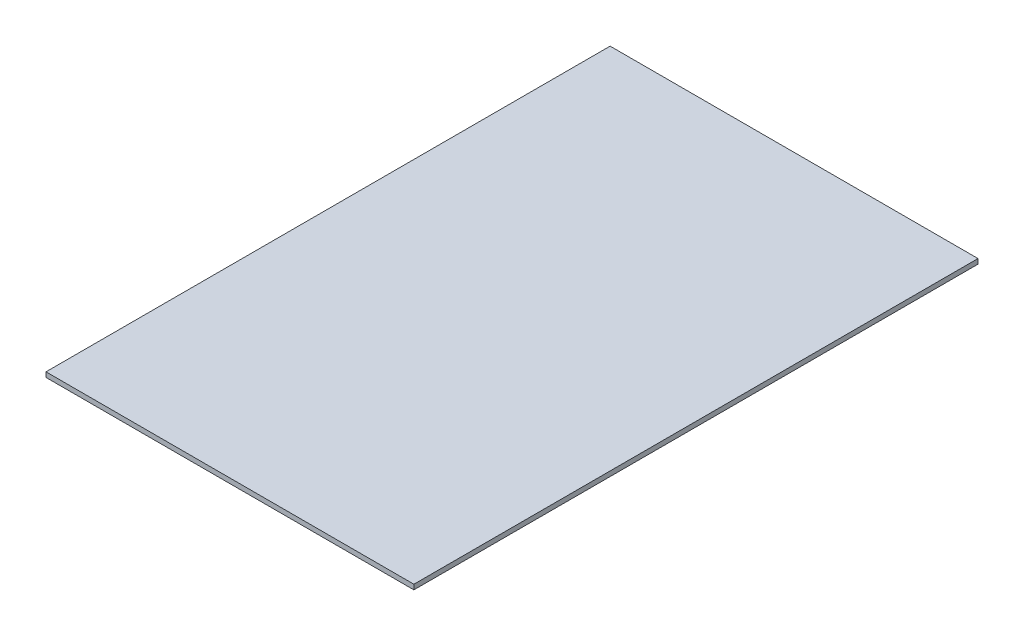
ISO-10303-21;
HEADER;
FILE_DESCRIPTION(('STEP AP214'),'2;1');
FILE_NAME('part.step','',(''),(''),'','','');
FILE_SCHEMA(('AUTOMOTIVE_DESIGN { 1 0 10303 214 1 1 1 1 }'));
ENDSEC;
DATA;
#1=APPLICATION_CONTEXT('core data for automotive mechanical design processes');
#2=APPLICATION_PROTOCOL_DEFINITION('international standard','automotive_design',2000,#1);
#3=PRODUCT_CONTEXT('',#1,'mechanical');
#4=PRODUCT('Part','Part','',(#3));
#5=PRODUCT_RELATED_PRODUCT_CATEGORY('part','',(#4));
#6=PRODUCT_DEFINITION_FORMATION('','',#4);
#7=PRODUCT_DEFINITION_CONTEXT('part definition',#1,'design');
#8=PRODUCT_DEFINITION('design','',#6,#7);
#9=PRODUCT_DEFINITION_SHAPE('','',#8);
#10=(LENGTH_UNIT() NAMED_UNIT(*) SI_UNIT(.MILLI.,.METRE.));
#11=(NAMED_UNIT(*) PLANE_ANGLE_UNIT() SI_UNIT($,.RADIAN.));
#12=(NAMED_UNIT(*) SI_UNIT($,.STERADIAN.) SOLID_ANGLE_UNIT());
#13=UNCERTAINTY_MEASURE_WITH_UNIT(LENGTH_MEASURE(1.E-05),#10,'distance_accuracy_value','');
#14=(GEOMETRIC_REPRESENTATION_CONTEXT(3) GLOBAL_UNCERTAINTY_ASSIGNED_CONTEXT((#13)) GLOBAL_UNIT_ASSIGNED_CONTEXT((#10,
#11,#12)) REPRESENTATION_CONTEXT('',''));
#15=CARTESIAN_POINT('',(0.,0.,0.));
#16=DIRECTION('',(0.,0.,1.));
#17=DIRECTION('',(1.,0.,0.));
#18=AXIS2_PLACEMENT_3D('',#15,#16,#17);
#19=CARTESIAN_POINT('',(-0.321302025404601,395.469835922906,-442.519627334862));
#20=DIRECTION('',(-1.,0.,0.));
#21=DIRECTION('',(0.,0.,1.));
#22=AXIS2_PLACEMENT_3D('',#19,#20,#21);
#23=PLANE('',#22);
#24=DIRECTION('',(0.,0.,1.));
#25=VECTOR('',#24,1.);
#26=CARTESIAN_POINT('',(-0.321302025404601,400.469835922906,-442.519627334862));
#27=LINE('',#26,#25);
#28=CARTESIAN_POINT('',(-0.321302025404618,400.469835922906,-430.019627334862));
#29=VERTEX_POINT('',#28);
#30=CARTESIAN_POINT('',(-0.321302025404643,400.469835922906,144.980372665138));
#31=VERTEX_POINT('',#30);
#32=EDGE_CURVE('E97',#29,#31,#27,.T.);
#33=ORIENTED_EDGE('',*,*,#32,.F.);
#34=DIRECTION('',(0.,1.,0.));
#35=VECTOR('',#34,1.);
#36=CARTESIAN_POINT('',(-0.321302025404618,395.469835922906,-430.019627334862));
#37=LINE('',#36,#35);
#38=CARTESIAN_POINT('',(-0.321302025404618,395.469835922906,-430.019627334862));
#39=VERTEX_POINT('',#38);
#40=EDGE_CURVE('E11',#39,#29,#37,.T.);
#41=ORIENTED_EDGE('',*,*,#40,.F.);
#42=DIRECTION('',(0.,0.,1.));
#43=VECTOR('',#42,1.);
#44=CARTESIAN_POINT('',(-0.321302025404601,395.469835922906,-442.519627334862));
#45=LINE('',#44,#43);
#46=CARTESIAN_POINT('',(-0.321302025404643,395.469835922906,144.980372665138));
#47=VERTEX_POINT('',#46);
#48=EDGE_CURVE('E91',#39,#47,#45,.T.);
#49=ORIENTED_EDGE('',*,*,#48,.T.);
#50=DIRECTION('',(0.,1.,0.));
#51=VECTOR('',#50,1.);
#52=CARTESIAN_POINT('',(-0.321302025404643,395.469835922906,144.980372665138));
#53=LINE('',#52,#51);
#54=EDGE_CURVE('E36',#47,#31,#53,.T.);
#55=ORIENTED_EDGE('',*,*,#54,.T.);
#56=EDGE_LOOP('',(#33,#41,#49,#55));
#57=FACE_BOUND('',#56,.T.);
#58=ADVANCED_FACE('F33',(#57),#23,.T.);
#59=CARTESIAN_POINT('',(-19.6213020254046,395.469835922906,-430.019627334862));
#60=DIRECTION('',(0.,0.,-1.));
#61=DIRECTION('',(-1.,0.,0.));
#62=AXIS2_PLACEMENT_3D('',#59,#60,#61);
#63=PLANE('',#62);
#64=DIRECTION('',(-1.,0.,0.));
#65=VECTOR('',#64,1.);
#66=CARTESIAN_POINT('',(-19.6213020254046,400.469835922906,-430.019627334862));
#67=LINE('',#66,#65);
#68=CARTESIAN_POINT('',(374.678697974595,400.469835922906,-430.019627334862));
#69=VERTEX_POINT('',#68);
#70=EDGE_CURVE('E93',#69,#29,#67,.T.);
#71=ORIENTED_EDGE('',*,*,#70,.F.);
#72=DIRECTION('',(0.,1.,0.));
#73=VECTOR('',#72,1.);
#74=CARTESIAN_POINT('',(374.678697974595,395.469835922906,-430.019627334862));
#75=LINE('',#74,#73);
#76=CARTESIAN_POINT('',(374.678697974595,395.469835922906,-430.019627334862));
#77=VERTEX_POINT('',#76);
#78=EDGE_CURVE('E42',#77,#69,#75,.T.);
#79=ORIENTED_EDGE('',*,*,#78,.F.);
#80=DIRECTION('',(-1.,0.,0.));
#81=VECTOR('',#80,1.);
#82=CARTESIAN_POINT('',(-19.6213020254046,395.469835922906,-430.019627334862));
#83=LINE('',#82,#81);
#84=EDGE_CURVE('E88',#77,#39,#83,.T.);
#85=ORIENTED_EDGE('',*,*,#84,.T.);
#86=ORIENTED_EDGE('',*,*,#40,.T.);
#87=EDGE_LOOP('',(#71,#79,#85,#86));
#88=FACE_BOUND('',#87,.T.);
#89=ADVANCED_FACE('F107',(#88),#63,.T.);
#90=CARTESIAN_POINT('',(374.678697974595,395.469835922906,-442.519627334862));
#91=DIRECTION('',(1.,0.,0.));
#92=DIRECTION('',(0.,0.,-1.));
#93=AXIS2_PLACEMENT_3D('',#90,#91,#92);
#94=PLANE('',#93);
#95=DIRECTION('',(0.,0.,-1.));
#96=VECTOR('',#95,1.);
#97=CARTESIAN_POINT('',(374.678697974595,400.469835922906,-442.519627334862));
#98=LINE('',#97,#96);
#99=CARTESIAN_POINT('',(374.678697974595,400.469835922906,144.980372665138));
#100=VERTEX_POINT('',#99);
#101=EDGE_CURVE('E83',#100,#69,#98,.T.);
#102=ORIENTED_EDGE('',*,*,#101,.F.);
#103=DIRECTION('',(0.,1.,0.));
#104=VECTOR('',#103,1.);
#105=CARTESIAN_POINT('',(374.678697974595,395.469835922906,144.980372665138));
#106=LINE('',#105,#104);
#107=CARTESIAN_POINT('',(374.678697974595,395.469835922906,144.980372665138));
#108=VERTEX_POINT('',#107);
#109=EDGE_CURVE('E78',#108,#100,#106,.T.);
#110=ORIENTED_EDGE('',*,*,#109,.F.);
#111=DIRECTION('',(0.,0.,-1.));
#112=VECTOR('',#111,1.);
#113=CARTESIAN_POINT('',(374.678697974595,395.469835922906,-442.519627334862));
#114=LINE('',#113,#112);
#115=EDGE_CURVE('E81',#108,#77,#114,.T.);
#116=ORIENTED_EDGE('',*,*,#115,.T.);
#117=ORIENTED_EDGE('',*,*,#78,.T.);
#118=EDGE_LOOP('',(#102,#110,#116,#117));
#119=FACE_BOUND('',#118,.T.);
#120=ADVANCED_FACE('F80',(#119),#94,.T.);
#121=CARTESIAN_POINT('',(-19.6213020254046,395.469835922906,144.980372665138));
#122=DIRECTION('',(0.,0.,1.));
#123=DIRECTION('',(1.,0.,0.));
#124=AXIS2_PLACEMENT_3D('',#121,#122,#123);
#125=PLANE('',#124);
#126=DIRECTION('',(1.,0.,0.));
#127=VECTOR('',#126,1.);
#128=CARTESIAN_POINT('',(-19.6213020254046,400.469835922906,144.980372665138));
#129=LINE('',#128,#127);
#130=EDGE_CURVE('E100',#31,#100,#129,.T.);
#131=ORIENTED_EDGE('',*,*,#130,.F.);
#132=ORIENTED_EDGE('',*,*,#54,.F.);
#133=DIRECTION('',(1.,0.,0.));
#134=VECTOR('',#133,1.);
#135=CARTESIAN_POINT('',(-19.6213020254046,395.469835922906,144.980372665138));
#136=LINE('',#135,#134);
#137=EDGE_CURVE('E87',#47,#108,#136,.T.);
#138=ORIENTED_EDGE('',*,*,#137,.T.);
#139=ORIENTED_EDGE('',*,*,#109,.T.);
#140=EDGE_LOOP('',(#131,#132,#138,#139));
#141=FACE_BOUND('',#140,.T.);
#142=ADVANCED_FACE('F90',(#141),#125,.T.);
#143=CARTESIAN_POINT('',(0.,395.469835922906,0.));
#144=DIRECTION('',(0.,1.,0.));
#145=DIRECTION('',(-1.,0.,0.));
#146=AXIS2_PLACEMENT_3D('',#143,#144,#145);
#147=PLANE('',#146);
#148=ORIENTED_EDGE('',*,*,#48,.F.);
#149=ORIENTED_EDGE('',*,*,#84,.F.);
#150=ORIENTED_EDGE('',*,*,#115,.F.);
#151=ORIENTED_EDGE('',*,*,#137,.F.);
#152=EDGE_LOOP('',(#148,#149,#150,#151));
#153=FACE_BOUND('',#152,.T.);
#154=ADVANCED_FACE('F86',(#153),#147,.F.);
#155=CARTESIAN_POINT('',(0.,400.469835922906,0.));
#156=DIRECTION('',(0.,1.,0.));
#157=DIRECTION('',(-1.,0.,0.));
#158=AXIS2_PLACEMENT_3D('',#155,#156,#157);
#159=PLANE('',#158);
#160=ORIENTED_EDGE('',*,*,#32,.T.);
#161=ORIENTED_EDGE('',*,*,#130,.T.);
#162=ORIENTED_EDGE('',*,*,#101,.T.);
#163=ORIENTED_EDGE('',*,*,#70,.T.);
#164=EDGE_LOOP('',(#160,#161,#162,#163));
#165=FACE_BOUND('',#164,.T.);
#166=ADVANCED_FACE('F106',(#165),#159,.T.);
#167=CLOSED_SHELL('',(#58,#89,#120,#142,#154,#166));
#168=MANIFOLD_SOLID_BREP('B2',#167);
#169=ADVANCED_BREP_SHAPE_REPRESENTATION('',(#18,#168),#14);
#170=SHAPE_DEFINITION_REPRESENTATION(#9,#169);
ENDSEC;
END-ISO-10303-21;
